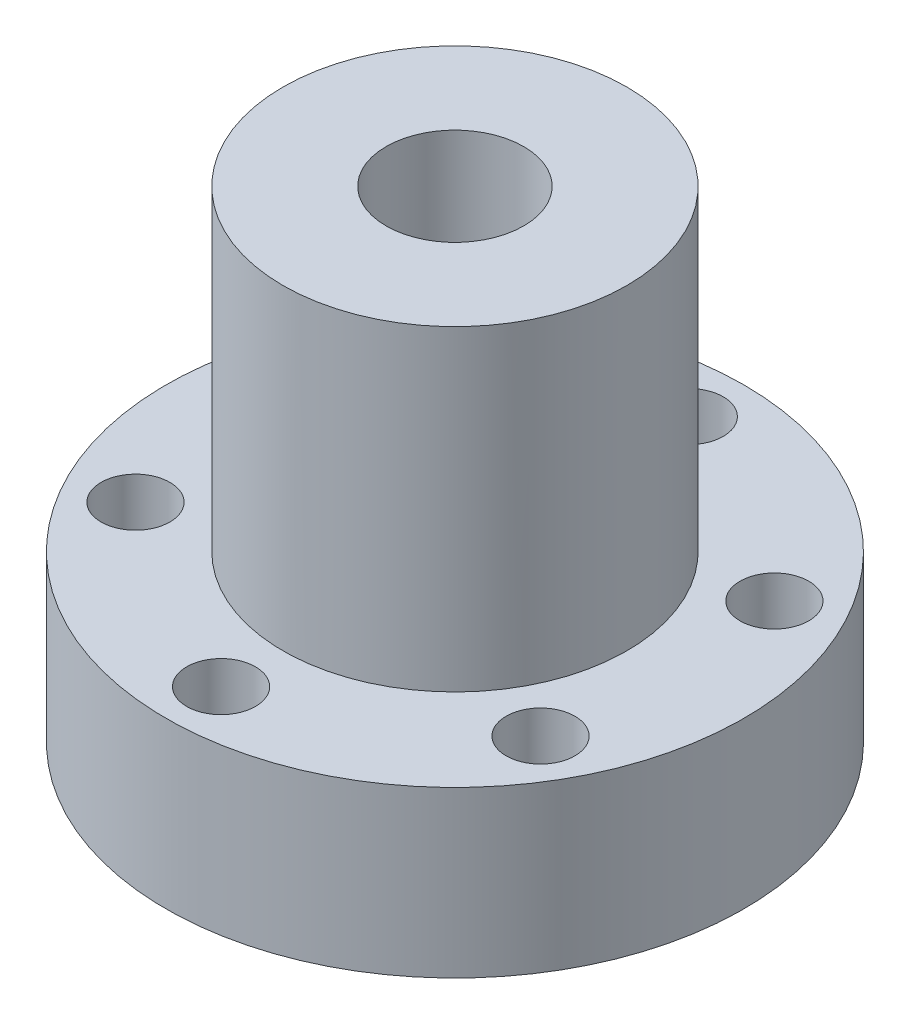
ISO-10303-21;
HEADER;
FILE_DESCRIPTION(('STEP AP214'),'2;1');
FILE_NAME('part.step','',(''),(''),'','','');
FILE_SCHEMA(('AUTOMOTIVE_DESIGN { 1 0 10303 214 1 1 1 1 }'));
ENDSEC;
DATA;
#1=APPLICATION_CONTEXT('core data for automotive mechanical design processes');
#2=APPLICATION_PROTOCOL_DEFINITION('international standard','automotive_design',2000,#1);
#3=PRODUCT_CONTEXT('',#1,'mechanical');
#4=PRODUCT('Part','Part','',(#3));
#5=PRODUCT_RELATED_PRODUCT_CATEGORY('part','',(#4));
#6=PRODUCT_DEFINITION_FORMATION('','',#4);
#7=PRODUCT_DEFINITION_CONTEXT('part definition',#1,'design');
#8=PRODUCT_DEFINITION('design','',#6,#7);
#9=PRODUCT_DEFINITION_SHAPE('','',#8);
#10=(LENGTH_UNIT() NAMED_UNIT(*) SI_UNIT(.MILLI.,.METRE.));
#11=(NAMED_UNIT(*) PLANE_ANGLE_UNIT() SI_UNIT($,.RADIAN.));
#12=(NAMED_UNIT(*) SI_UNIT($,.STERADIAN.) SOLID_ANGLE_UNIT());
#13=UNCERTAINTY_MEASURE_WITH_UNIT(LENGTH_MEASURE(1.E-05),#10,'distance_accuracy_value','');
#14=(GEOMETRIC_REPRESENTATION_CONTEXT(3) GLOBAL_UNCERTAINTY_ASSIGNED_CONTEXT((#13)) GLOBAL_UNIT_ASSIGNED_CONTEXT((#10,
#11,#12)) REPRESENTATION_CONTEXT('',''));
#15=CARTESIAN_POINT('',(0.,0.,0.));
#16=DIRECTION('',(0.,0.,1.));
#17=DIRECTION('',(1.,0.,0.));
#18=AXIS2_PLACEMENT_3D('',#15,#16,#17);
#19=CARTESIAN_POINT('',(0.,23.,0.));
#20=DIRECTION('',(0.,1.,0.));
#21=DIRECTION('',(0.,0.,1.));
#22=AXIS2_PLACEMENT_3D('',#19,#20,#21);
#23=PLANE('',#22);
#24=CARTESIAN_POINT('',(0.,23.,0.));
#25=DIRECTION('',(0.,1.,0.));
#26=DIRECTION('',(0.,0.,1.));
#27=AXIS2_PLACEMENT_3D('',#24,#25,#26);
#28=CIRCLE('',#27,12.5);
#29=CARTESIAN_POINT('',(0.,23.,12.5));
#30=VERTEX_POINT('',#29);
#31=EDGE_CURVE('E10',#30,#30,#28,.T.);
#32=ORIENTED_EDGE('',*,*,#31,.T.);
#33=EDGE_LOOP('',(#32));
#34=FACE_BOUND('',#33,.T.);
#35=CARTESIAN_POINT('',(0.,23.,0.));
#36=DIRECTION('',(0.,1.,0.));
#37=DIRECTION('',(0.,0.,1.));
#38=AXIS2_PLACEMENT_3D('',#35,#36,#37);
#39=CIRCLE('',#38,5.);
#40=CARTESIAN_POINT('',(0.,23.,5.));
#41=VERTEX_POINT('',#40);
#42=EDGE_CURVE('E38',#41,#41,#39,.T.);
#43=ORIENTED_EDGE('',*,*,#42,.F.);
#44=EDGE_LOOP('',(#43));
#45=FACE_BOUND('',#44,.T.);
#46=ADVANCED_FACE('F31',(#34,#45),#23,.T.);
#47=CARTESIAN_POINT('',(0.,23.,0.));
#48=DIRECTION('',(0.,-1.,0.));
#49=DIRECTION('',(0.,0.,-1.));
#50=AXIS2_PLACEMENT_3D('',#47,#48,#49);
#51=CYLINDRICAL_SURFACE('',#50,12.5);
#52=ORIENTED_EDGE('',*,*,#31,.F.);
#53=EDGE_LOOP('',(#52));
#54=FACE_BOUND('',#53,.T.);
#55=CARTESIAN_POINT('',(0.,0.,0.));
#56=DIRECTION('',(0.,-1.,0.));
#57=DIRECTION('',(0.,0.,-1.));
#58=AXIS2_PLACEMENT_3D('',#55,#56,#57);
#59=CIRCLE('',#58,12.5);
#60=CARTESIAN_POINT('',(0.,0.,-12.5));
#61=VERTEX_POINT('',#60);
#62=EDGE_CURVE('E42',#61,#61,#59,.T.);
#63=ORIENTED_EDGE('',*,*,#62,.F.);
#64=EDGE_LOOP('',(#63));
#65=FACE_BOUND('',#64,.T.);
#66=ADVANCED_FACE('F33',(#54,#65),#51,.T.);
#67=CARTESIAN_POINT('',(0.,23.,0.));
#68=DIRECTION('',(0.,-1.,0.));
#69=DIRECTION('',(0.,0.,-1.));
#70=AXIS2_PLACEMENT_3D('',#67,#68,#69);
#71=CYLINDRICAL_SURFACE('',#70,5.);
#72=ORIENTED_EDGE('',*,*,#42,.T.);
#73=EDGE_LOOP('',(#72));
#74=FACE_BOUND('',#73,.T.);
#75=CARTESIAN_POINT('',(0.,-12.,0.));
#76=DIRECTION('',(0.,-1.,0.));
#77=DIRECTION('',(0.,0.,-1.));
#78=AXIS2_PLACEMENT_3D('',#75,#76,#77);
#79=CIRCLE('',#78,5.);
#80=CARTESIAN_POINT('',(0.,-12.,-5.));
#81=VERTEX_POINT('',#80);
#82=EDGE_CURVE('E52',#81,#81,#79,.T.);
#83=ORIENTED_EDGE('',*,*,#82,.T.);
#84=EDGE_LOOP('',(#83));
#85=FACE_BOUND('',#84,.T.);
#86=ADVANCED_FACE('F107',(#74,#85),#71,.F.);
#87=CARTESIAN_POINT('',(0.,0.,0.));
#88=DIRECTION('',(0.,-1.,0.));
#89=DIRECTION('',(0.,0.,-1.));
#90=AXIS2_PLACEMENT_3D('',#87,#88,#89);
#91=PLANE('',#90);
#92=CARTESIAN_POINT('',(-14.722431864335,0.,-8.49999999999936));
#93=DIRECTION('',(0.,1.,0.));
#94=DIRECTION('',(0.,0.,1.));
#95=AXIS2_PLACEMENT_3D('',#92,#93,#94);
#96=CIRCLE('',#95,2.5);
#97=CARTESIAN_POINT('',(-14.722431864335,0.,-5.99999999999936));
#98=VERTEX_POINT('',#97);
#99=EDGE_CURVE('E88',#98,#98,#96,.T.);
#100=ORIENTED_EDGE('',*,*,#99,.F.);
#101=EDGE_LOOP('',(#100));
#102=FACE_BOUND('',#101,.T.);
#103=CARTESIAN_POINT('',(-14.7224318643343,0.,8.50000000000063));
#104=DIRECTION('',(0.,1.,0.));
#105=DIRECTION('',(0.,0.,1.));
#106=AXIS2_PLACEMENT_3D('',#103,#104,#105);
#107=CIRCLE('',#106,2.5);
#108=CARTESIAN_POINT('',(-14.7224318643343,0.,11.0000000000006));
#109=VERTEX_POINT('',#108);
#110=EDGE_CURVE('E82',#109,#109,#107,.T.);
#111=ORIENTED_EDGE('',*,*,#110,.F.);
#112=EDGE_LOOP('',(#111));
#113=FACE_BOUND('',#112,.T.);
#114=CARTESIAN_POINT('',(1.53007092844963E-12,0.,17.));
#115=DIRECTION('',(0.,1.,0.));
#116=DIRECTION('',(0.,0.,1.));
#117=AXIS2_PLACEMENT_3D('',#114,#115,#116);
#118=CIRCLE('',#117,2.5);
#119=CARTESIAN_POINT('',(1.53007092844963E-12,0.,19.5));
#120=VERTEX_POINT('',#119);
#121=EDGE_CURVE('E76',#120,#120,#118,.T.);
#122=ORIENTED_EDGE('',*,*,#121,.F.);
#123=EDGE_LOOP('',(#122));
#124=FACE_BOUND('',#123,.T.);
#125=CARTESIAN_POINT('',(14.7224318643366,0.,8.49999999999937));
#126=DIRECTION('',(0.,1.,0.));
#127=DIRECTION('',(0.,0.,1.));
#128=AXIS2_PLACEMENT_3D('',#125,#126,#127);
#129=CIRCLE('',#128,2.5);
#130=CARTESIAN_POINT('',(14.7224318643366,0.,10.9999999999994));
#131=VERTEX_POINT('',#130);
#132=EDGE_CURVE('E70',#131,#131,#129,.T.);
#133=ORIENTED_EDGE('',*,*,#132,.F.);
#134=EDGE_LOOP('',(#133));
#135=FACE_BOUND('',#134,.T.);
#136=CARTESIAN_POINT('',(14.7224318643359,0.,-8.50000000000063));
#137=DIRECTION('',(0.,1.,0.));
#138=DIRECTION('',(0.,0.,1.));
#139=AXIS2_PLACEMENT_3D('',#136,#137,#138);
#140=CIRCLE('',#139,2.5);
#141=CARTESIAN_POINT('',(14.7224318643359,0.,-6.00000000000063));
#142=VERTEX_POINT('',#141);
#143=EDGE_CURVE('E64',#142,#142,#140,.T.);
#144=ORIENTED_EDGE('',*,*,#143,.F.);
#145=EDGE_LOOP('',(#144));
#146=FACE_BOUND('',#145,.T.);
#147=CARTESIAN_POINT('',(0.,0.,-17.));
#148=DIRECTION('',(0.,1.,0.));
#149=DIRECTION('',(0.,0.,1.));
#150=AXIS2_PLACEMENT_3D('',#147,#148,#149);
#151=CIRCLE('',#150,2.5);
#152=CARTESIAN_POINT('',(0.,0.,-14.5));
#153=VERTEX_POINT('',#152);
#154=EDGE_CURVE('E58',#153,#153,#151,.T.);
#155=ORIENTED_EDGE('',*,*,#154,.F.);
#156=EDGE_LOOP('',(#155));
#157=FACE_BOUND('',#156,.T.);
#158=CARTESIAN_POINT('',(0.,0.,0.));
#159=DIRECTION('',(0.,-1.,0.));
#160=DIRECTION('',(0.,0.,-1.));
#161=AXIS2_PLACEMENT_3D('',#158,#159,#160);
#162=CIRCLE('',#161,21.);
#163=CARTESIAN_POINT('',(0.,0.,-21.));
#164=VERTEX_POINT('',#163);
#165=EDGE_CURVE('E49',#164,#164,#162,.T.);
#166=ORIENTED_EDGE('',*,*,#165,.F.);
#167=EDGE_LOOP('',(#166));
#168=FACE_BOUND('',#167,.T.);
#169=ORIENTED_EDGE('',*,*,#62,.T.);
#170=EDGE_LOOP('',(#169));
#171=FACE_BOUND('',#170,.T.);
#172=ADVANCED_FACE('F104',(#102,#113,#124,#135,#146,#157,#168,#171),#91,.F.);
#173=CARTESIAN_POINT('',(0.,-12.,0.));
#174=DIRECTION('',(0.,-1.,0.));
#175=DIRECTION('',(0.,0.,-1.));
#176=AXIS2_PLACEMENT_3D('',#173,#174,#175);
#177=PLANE('',#176);
#178=CARTESIAN_POINT('',(-14.722431864335,-12.,-8.49999999999936));
#179=DIRECTION('',(0.,1.,0.));
#180=DIRECTION('',(0.,0.,1.));
#181=AXIS2_PLACEMENT_3D('',#178,#179,#180);
#182=CIRCLE('',#181,2.5);
#183=CARTESIAN_POINT('',(-14.722431864335,-12.,-5.99999999999936));
#184=VERTEX_POINT('',#183);
#185=EDGE_CURVE('E85',#184,#184,#182,.T.);
#186=ORIENTED_EDGE('',*,*,#185,.T.);
#187=EDGE_LOOP('',(#186));
#188=FACE_BOUND('',#187,.T.);
#189=CARTESIAN_POINT('',(-14.7224318643343,-12.,8.50000000000063));
#190=DIRECTION('',(0.,1.,0.));
#191=DIRECTION('',(0.,0.,1.));
#192=AXIS2_PLACEMENT_3D('',#189,#190,#191);
#193=CIRCLE('',#192,2.5);
#194=CARTESIAN_POINT('',(-14.7224318643343,-12.,11.0000000000006));
#195=VERTEX_POINT('',#194);
#196=EDGE_CURVE('E79',#195,#195,#193,.T.);
#197=ORIENTED_EDGE('',*,*,#196,.T.);
#198=EDGE_LOOP('',(#197));
#199=FACE_BOUND('',#198,.T.);
#200=CARTESIAN_POINT('',(1.53007092844963E-12,-12.,17.));
#201=DIRECTION('',(0.,1.,0.));
#202=DIRECTION('',(0.,0.,1.));
#203=AXIS2_PLACEMENT_3D('',#200,#201,#202);
#204=CIRCLE('',#203,2.5);
#205=CARTESIAN_POINT('',(1.53007092844963E-12,-12.,19.5));
#206=VERTEX_POINT('',#205);
#207=EDGE_CURVE('E73',#206,#206,#204,.T.);
#208=ORIENTED_EDGE('',*,*,#207,.T.);
#209=EDGE_LOOP('',(#208));
#210=FACE_BOUND('',#209,.T.);
#211=CARTESIAN_POINT('',(14.7224318643366,-12.,8.49999999999937));
#212=DIRECTION('',(0.,1.,0.));
#213=DIRECTION('',(0.,0.,1.));
#214=AXIS2_PLACEMENT_3D('',#211,#212,#213);
#215=CIRCLE('',#214,2.5);
#216=CARTESIAN_POINT('',(14.7224318643366,-12.,10.9999999999994));
#217=VERTEX_POINT('',#216);
#218=EDGE_CURVE('E67',#217,#217,#215,.T.);
#219=ORIENTED_EDGE('',*,*,#218,.T.);
#220=EDGE_LOOP('',(#219));
#221=FACE_BOUND('',#220,.T.);
#222=CARTESIAN_POINT('',(14.7224318643359,-12.,-8.50000000000063));
#223=DIRECTION('',(0.,1.,0.));
#224=DIRECTION('',(0.,0.,1.));
#225=AXIS2_PLACEMENT_3D('',#222,#223,#224);
#226=CIRCLE('',#225,2.5);
#227=CARTESIAN_POINT('',(14.7224318643359,-12.,-6.00000000000063));
#228=VERTEX_POINT('',#227);
#229=EDGE_CURVE('E61',#228,#228,#226,.T.);
#230=ORIENTED_EDGE('',*,*,#229,.T.);
#231=EDGE_LOOP('',(#230));
#232=FACE_BOUND('',#231,.T.);
#233=CARTESIAN_POINT('',(0.,-12.,-17.));
#234=DIRECTION('',(0.,1.,0.));
#235=DIRECTION('',(0.,0.,1.));
#236=AXIS2_PLACEMENT_3D('',#233,#234,#235);
#237=CIRCLE('',#236,2.5);
#238=CARTESIAN_POINT('',(0.,-12.,-14.5));
#239=VERTEX_POINT('',#238);
#240=EDGE_CURVE('E57',#239,#239,#237,.T.);
#241=ORIENTED_EDGE('',*,*,#240,.T.);
#242=EDGE_LOOP('',(#241));
#243=FACE_BOUND('',#242,.T.);
#244=CARTESIAN_POINT('',(0.,-12.,0.));
#245=DIRECTION('',(0.,-1.,0.));
#246=DIRECTION('',(0.,0.,-1.));
#247=AXIS2_PLACEMENT_3D('',#244,#245,#246);
#248=CIRCLE('',#247,21.);
#249=CARTESIAN_POINT('',(0.,-12.,-21.));
#250=VERTEX_POINT('',#249);
#251=EDGE_CURVE('E46',#250,#250,#248,.T.);
#252=ORIENTED_EDGE('',*,*,#251,.T.);
#253=EDGE_LOOP('',(#252));
#254=FACE_BOUND('',#253,.T.);
#255=ORIENTED_EDGE('',*,*,#82,.F.);
#256=EDGE_LOOP('',(#255));
#257=FACE_BOUND('',#256,.T.);
#258=ADVANCED_FACE('F94',(#188,#199,#210,#221,#232,#243,#254,#257),#177,.T.);
#259=CARTESIAN_POINT('',(0.,-12.,0.));
#260=DIRECTION('',(0.,1.,0.));
#261=DIRECTION('',(0.,0.,1.));
#262=AXIS2_PLACEMENT_3D('',#259,#260,#261);
#263=CYLINDRICAL_SURFACE('',#262,21.);
#264=ORIENTED_EDGE('',*,*,#251,.F.);
#265=EDGE_LOOP('',(#264));
#266=FACE_BOUND('',#265,.T.);
#267=ORIENTED_EDGE('',*,*,#165,.T.);
#268=EDGE_LOOP('',(#267));
#269=FACE_BOUND('',#268,.T.);
#270=ADVANCED_FACE('F134',(#266,#269),#263,.T.);
#271=CARTESIAN_POINT('',(0.,-12.,-17.));
#272=DIRECTION('',(0.,1.,0.));
#273=DIRECTION('',(0.,0.,1.));
#274=AXIS2_PLACEMENT_3D('',#271,#272,#273);
#275=CYLINDRICAL_SURFACE('',#274,2.5);
#276=ORIENTED_EDGE('',*,*,#240,.F.);
#277=EDGE_LOOP('',(#276));
#278=FACE_BOUND('',#277,.T.);
#279=ORIENTED_EDGE('',*,*,#154,.T.);
#280=EDGE_LOOP('',(#279));
#281=FACE_BOUND('',#280,.T.);
#282=ADVANCED_FACE('F136',(#278,#281),#275,.F.);
#283=CARTESIAN_POINT('',(14.7224318643359,-12.,-8.50000000000063));
#284=DIRECTION('',(0.,1.,0.));
#285=DIRECTION('',(0.,0.,1.));
#286=AXIS2_PLACEMENT_3D('',#283,#284,#285);
#287=CYLINDRICAL_SURFACE('',#286,2.5);
#288=ORIENTED_EDGE('',*,*,#229,.F.);
#289=EDGE_LOOP('',(#288));
#290=FACE_BOUND('',#289,.T.);
#291=ORIENTED_EDGE('',*,*,#143,.T.);
#292=EDGE_LOOP('',(#291));
#293=FACE_BOUND('',#292,.T.);
#294=ADVANCED_FACE('F143',(#290,#293),#287,.F.);
#295=CARTESIAN_POINT('',(14.7224318643366,-12.,8.49999999999937));
#296=DIRECTION('',(0.,1.,0.));
#297=DIRECTION('',(0.,0.,1.));
#298=AXIS2_PLACEMENT_3D('',#295,#296,#297);
#299=CYLINDRICAL_SURFACE('',#298,2.5);
#300=ORIENTED_EDGE('',*,*,#218,.F.);
#301=EDGE_LOOP('',(#300));
#302=FACE_BOUND('',#301,.T.);
#303=ORIENTED_EDGE('',*,*,#132,.T.);
#304=EDGE_LOOP('',(#303));
#305=FACE_BOUND('',#304,.T.);
#306=ADVANCED_FACE('F147',(#302,#305),#299,.F.);
#307=CARTESIAN_POINT('',(1.53007092844963E-12,-12.,17.));
#308=DIRECTION('',(0.,1.,0.));
#309=DIRECTION('',(0.,0.,1.));
#310=AXIS2_PLACEMENT_3D('',#307,#308,#309);
#311=CYLINDRICAL_SURFACE('',#310,2.5);
#312=ORIENTED_EDGE('',*,*,#207,.F.);
#313=EDGE_LOOP('',(#312));
#314=FACE_BOUND('',#313,.T.);
#315=ORIENTED_EDGE('',*,*,#121,.T.);
#316=EDGE_LOOP('',(#315));
#317=FACE_BOUND('',#316,.T.);
#318=ADVANCED_FACE('F151',(#314,#317),#311,.F.);
#319=CARTESIAN_POINT('',(-14.7224318643343,-12.,8.50000000000063));
#320=DIRECTION('',(0.,1.,0.));
#321=DIRECTION('',(0.,0.,1.));
#322=AXIS2_PLACEMENT_3D('',#319,#320,#321);
#323=CYLINDRICAL_SURFACE('',#322,2.5);
#324=ORIENTED_EDGE('',*,*,#196,.F.);
#325=EDGE_LOOP('',(#324));
#326=FACE_BOUND('',#325,.T.);
#327=ORIENTED_EDGE('',*,*,#110,.T.);
#328=EDGE_LOOP('',(#327));
#329=FACE_BOUND('',#328,.T.);
#330=ADVANCED_FACE('F100',(#326,#329),#323,.F.);
#331=CARTESIAN_POINT('',(-14.722431864335,-12.,-8.49999999999936));
#332=DIRECTION('',(0.,1.,0.));
#333=DIRECTION('',(0.,0.,1.));
#334=AXIS2_PLACEMENT_3D('',#331,#332,#333);
#335=CYLINDRICAL_SURFACE('',#334,2.5);
#336=ORIENTED_EDGE('',*,*,#185,.F.);
#337=EDGE_LOOP('',(#336));
#338=FACE_BOUND('',#337,.T.);
#339=ORIENTED_EDGE('',*,*,#99,.T.);
#340=EDGE_LOOP('',(#339));
#341=FACE_BOUND('',#340,.T.);
#342=ADVANCED_FACE('F97',(#338,#341),#335,.F.);
#343=CLOSED_SHELL('',(#46,#66,#86,#172,#258,#270,#282,#294,#306,#318,#330,#342));
#344=MANIFOLD_SOLID_BREP('B2',#343);
#345=ADVANCED_BREP_SHAPE_REPRESENTATION('',(#18,#344),#14);
#346=SHAPE_DEFINITION_REPRESENTATION(#9,#345);
ENDSEC;
END-ISO-10303-21;
